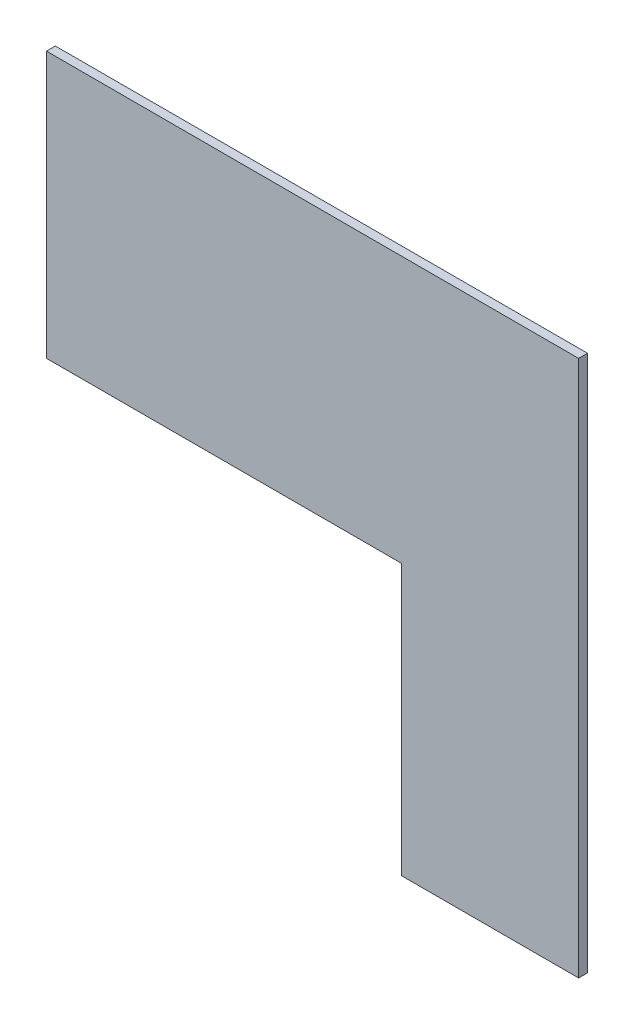
ISO-10303-21;
HEADER;
FILE_DESCRIPTION(('STEP AP214'),'2;1');
FILE_NAME('part.step','',(''),(''),'','','');
FILE_SCHEMA(('AUTOMOTIVE_DESIGN { 1 0 10303 214 1 1 1 1 }'));
ENDSEC;
DATA;
#1=APPLICATION_CONTEXT('core data for automotive mechanical design processes');
#2=APPLICATION_PROTOCOL_DEFINITION('international standard','automotive_design',2000,#1);
#3=PRODUCT_CONTEXT('',#1,'mechanical');
#4=PRODUCT('Part','Part','',(#3));
#5=PRODUCT_RELATED_PRODUCT_CATEGORY('part','',(#4));
#6=PRODUCT_DEFINITION_FORMATION('','',#4);
#7=PRODUCT_DEFINITION_CONTEXT('part definition',#1,'design');
#8=PRODUCT_DEFINITION('design','',#6,#7);
#9=PRODUCT_DEFINITION_SHAPE('','',#8);
#10=(LENGTH_UNIT() NAMED_UNIT(*) SI_UNIT(.MILLI.,.METRE.));
#11=(NAMED_UNIT(*) PLANE_ANGLE_UNIT() SI_UNIT($,.RADIAN.));
#12=(NAMED_UNIT(*) SI_UNIT($,.STERADIAN.) SOLID_ANGLE_UNIT());
#13=UNCERTAINTY_MEASURE_WITH_UNIT(LENGTH_MEASURE(1.E-05),#10,'distance_accuracy_value','');
#14=(GEOMETRIC_REPRESENTATION_CONTEXT(3) GLOBAL_UNCERTAINTY_ASSIGNED_CONTEXT((#13)) GLOBAL_UNIT_ASSIGNED_CONTEXT((#10,
#11,#12)) REPRESENTATION_CONTEXT('',''));
#15=CARTESIAN_POINT('',(0.,0.,0.));
#16=DIRECTION('',(0.,0.,1.));
#17=DIRECTION('',(1.,0.,0.));
#18=AXIS2_PLACEMENT_3D('',#15,#16,#17);
#19=CARTESIAN_POINT('',(800.,0.,20.));
#20=DIRECTION('',(0.,1.,0.));
#21=DIRECTION('',(0.,0.,1.));
#22=AXIS2_PLACEMENT_3D('',#19,#20,#21);
#23=PLANE('',#22);
#24=DIRECTION('',(1.,0.,0.));
#25=VECTOR('',#24,1.);
#26=CARTESIAN_POINT('',(800.,0.,0.));
#27=LINE('',#26,#25);
#28=CARTESIAN_POINT('',(0.,0.,0.));
#29=VERTEX_POINT('',#28);
#30=CARTESIAN_POINT('',(800.,0.,0.));
#31=VERTEX_POINT('',#30);
#32=EDGE_CURVE('E117',#29,#31,#27,.T.);
#33=ORIENTED_EDGE('',*,*,#32,.T.);
#34=DIRECTION('',(0.,0.,-1.));
#35=VECTOR('',#34,1.);
#36=CARTESIAN_POINT('',(800.,0.,20.));
#37=LINE('',#36,#35);
#38=CARTESIAN_POINT('',(800.,0.,20.));
#39=VERTEX_POINT('',#38);
#40=EDGE_CURVE('E11',#39,#31,#37,.T.);
#41=ORIENTED_EDGE('',*,*,#40,.F.);
#42=DIRECTION('',(1.,0.,0.));
#43=VECTOR('',#42,1.);
#44=CARTESIAN_POINT('',(800.,0.,20.));
#45=LINE('',#44,#43);
#46=CARTESIAN_POINT('',(0.,0.,20.));
#47=VERTEX_POINT('',#46);
#48=EDGE_CURVE('E127',#47,#39,#45,.T.);
#49=ORIENTED_EDGE('',*,*,#48,.F.);
#50=DIRECTION('',(0.,0.,-1.));
#51=VECTOR('',#50,1.);
#52=CARTESIAN_POINT('',(0.,0.,20.));
#53=LINE('',#52,#51);
#54=EDGE_CURVE('E113',#47,#29,#53,.T.);
#55=ORIENTED_EDGE('',*,*,#54,.T.);
#56=EDGE_LOOP('',(#33,#41,#49,#55));
#57=FACE_BOUND('',#56,.T.);
#58=ADVANCED_FACE('F33',(#57),#23,.F.);
#59=CARTESIAN_POINT('',(800.,-610.,20.));
#60=DIRECTION('',(1.,0.,0.));
#61=DIRECTION('',(0.,0.,-1.));
#62=AXIS2_PLACEMENT_3D('',#59,#60,#61);
#63=PLANE('',#62);
#64=DIRECTION('',(0.,-1.,0.));
#65=VECTOR('',#64,1.);
#66=CARTESIAN_POINT('',(800.,-610.,0.));
#67=LINE('',#66,#65);
#68=CARTESIAN_POINT('',(800.,-610.,0.));
#69=VERTEX_POINT('',#68);
#70=EDGE_CURVE('E120',#31,#69,#67,.T.);
#71=ORIENTED_EDGE('',*,*,#70,.T.);
#72=DIRECTION('',(0.,0.,-1.));
#73=VECTOR('',#72,1.);
#74=CARTESIAN_POINT('',(800.,-610.,20.));
#75=LINE('',#74,#73);
#76=CARTESIAN_POINT('',(800.,-610.,20.));
#77=VERTEX_POINT('',#76);
#78=EDGE_CURVE('E41',#77,#69,#75,.T.);
#79=ORIENTED_EDGE('',*,*,#78,.F.);
#80=DIRECTION('',(0.,-1.,0.));
#81=VECTOR('',#80,1.);
#82=CARTESIAN_POINT('',(800.,-610.,20.));
#83=LINE('',#82,#81);
#84=EDGE_CURVE('E86',#39,#77,#83,.T.);
#85=ORIENTED_EDGE('',*,*,#84,.F.);
#86=ORIENTED_EDGE('',*,*,#40,.T.);
#87=EDGE_LOOP('',(#71,#79,#85,#86));
#88=FACE_BOUND('',#87,.T.);
#89=ADVANCED_FACE('F151',(#88),#63,.F.);
#90=CARTESIAN_POINT('',(1200.,-610.,20.));
#91=DIRECTION('',(0.,1.,0.));
#92=DIRECTION('',(-1.,0.,0.));
#93=AXIS2_PLACEMENT_3D('',#90,#91,#92);
#94=PLANE('',#93);
#95=DIRECTION('',(1.,0.,0.));
#96=VECTOR('',#95,1.);
#97=CARTESIAN_POINT('',(1200.,-610.,0.));
#98=LINE('',#97,#96);
#99=CARTESIAN_POINT('',(1200.,-610.,0.));
#100=VERTEX_POINT('',#99);
#101=EDGE_CURVE('E122',#69,#100,#98,.T.);
#102=ORIENTED_EDGE('',*,*,#101,.T.);
#103=DIRECTION('',(0.,0.,-1.));
#104=VECTOR('',#103,1.);
#105=CARTESIAN_POINT('',(1200.,-610.,20.));
#106=LINE('',#105,#104);
#107=CARTESIAN_POINT('',(1200.,-610.,20.));
#108=VERTEX_POINT('',#107);
#109=EDGE_CURVE('E108',#108,#100,#106,.T.);
#110=ORIENTED_EDGE('',*,*,#109,.F.);
#111=DIRECTION('',(1.,0.,0.));
#112=VECTOR('',#111,1.);
#113=CARTESIAN_POINT('',(1200.,-610.,20.));
#114=LINE('',#113,#112);
#115=EDGE_CURVE('E99',#77,#108,#114,.T.);
#116=ORIENTED_EDGE('',*,*,#115,.F.);
#117=ORIENTED_EDGE('',*,*,#78,.T.);
#118=EDGE_LOOP('',(#102,#110,#116,#117));
#119=FACE_BOUND('',#118,.T.);
#120=ADVANCED_FACE('F133',(#119),#94,.F.);
#121=CARTESIAN_POINT('',(1200.,600.,20.));
#122=DIRECTION('',(-1.,0.,0.));
#123=DIRECTION('',(0.,-1.,0.));
#124=AXIS2_PLACEMENT_3D('',#121,#122,#123);
#125=PLANE('',#124);
#126=DIRECTION('',(0.,1.,0.));
#127=VECTOR('',#126,1.);
#128=CARTESIAN_POINT('',(1200.,600.,0.));
#129=LINE('',#128,#127);
#130=CARTESIAN_POINT('',(1200.,600.,0.));
#131=VERTEX_POINT('',#130);
#132=EDGE_CURVE('E107',#100,#131,#129,.T.);
#133=ORIENTED_EDGE('',*,*,#132,.T.);
#134=DIRECTION('',(0.,0.,-1.));
#135=VECTOR('',#134,1.);
#136=CARTESIAN_POINT('',(1200.,600.,20.));
#137=LINE('',#136,#135);
#138=CARTESIAN_POINT('',(1200.,600.,20.));
#139=VERTEX_POINT('',#138);
#140=EDGE_CURVE('E104',#139,#131,#137,.T.);
#141=ORIENTED_EDGE('',*,*,#140,.F.);
#142=DIRECTION('',(0.,1.,0.));
#143=VECTOR('',#142,1.);
#144=CARTESIAN_POINT('',(1200.,600.,20.));
#145=LINE('',#144,#143);
#146=EDGE_CURVE('E93',#108,#139,#145,.T.);
#147=ORIENTED_EDGE('',*,*,#146,.F.);
#148=ORIENTED_EDGE('',*,*,#109,.T.);
#149=EDGE_LOOP('',(#133,#141,#147,#148));
#150=FACE_BOUND('',#149,.T.);
#151=ADVANCED_FACE('F105',(#150),#125,.F.);
#152=CARTESIAN_POINT('',(0.,600.,20.));
#153=DIRECTION('',(0.,-1.,0.));
#154=DIRECTION('',(0.,0.,-1.));
#155=AXIS2_PLACEMENT_3D('',#152,#153,#154);
#156=PLANE('',#155);
#157=DIRECTION('',(-1.,0.,0.));
#158=VECTOR('',#157,1.);
#159=CARTESIAN_POINT('',(0.,600.,0.));
#160=LINE('',#159,#158);
#161=CARTESIAN_POINT('',(0.,600.,0.));
#162=VERTEX_POINT('',#161);
#163=EDGE_CURVE('E72',#131,#162,#160,.T.);
#164=ORIENTED_EDGE('',*,*,#163,.T.);
#165=DIRECTION('',(0.,0.,-1.));
#166=VECTOR('',#165,1.);
#167=CARTESIAN_POINT('',(0.,600.,20.));
#168=LINE('',#167,#166);
#169=CARTESIAN_POINT('',(0.,600.,20.));
#170=VERTEX_POINT('',#169);
#171=EDGE_CURVE('E109',#170,#162,#168,.T.);
#172=ORIENTED_EDGE('',*,*,#171,.F.);
#173=DIRECTION('',(-1.,0.,0.));
#174=VECTOR('',#173,1.);
#175=CARTESIAN_POINT('',(0.,600.,20.));
#176=LINE('',#175,#174);
#177=EDGE_CURVE('E97',#139,#170,#176,.T.);
#178=ORIENTED_EDGE('',*,*,#177,.F.);
#179=ORIENTED_EDGE('',*,*,#140,.T.);
#180=EDGE_LOOP('',(#164,#172,#178,#179));
#181=FACE_BOUND('',#180,.T.);
#182=ADVANCED_FACE('F111',(#181),#156,.F.);
#183=CARTESIAN_POINT('',(0.,0.,20.));
#184=DIRECTION('',(1.,0.,0.));
#185=DIRECTION('',(0.,0.,-1.));
#186=AXIS2_PLACEMENT_3D('',#183,#184,#185);
#187=PLANE('',#186);
#188=DIRECTION('',(0.,-1.,0.));
#189=VECTOR('',#188,1.);
#190=CARTESIAN_POINT('',(0.,0.,0.));
#191=LINE('',#190,#189);
#192=EDGE_CURVE('E78',#162,#29,#191,.T.);
#193=ORIENTED_EDGE('',*,*,#192,.T.);
#194=ORIENTED_EDGE('',*,*,#54,.F.);
#195=DIRECTION('',(0.,-1.,0.));
#196=VECTOR('',#195,1.);
#197=CARTESIAN_POINT('',(0.,0.,20.));
#198=LINE('',#197,#196);
#199=EDGE_CURVE('E49',#170,#47,#198,.T.);
#200=ORIENTED_EDGE('',*,*,#199,.F.);
#201=ORIENTED_EDGE('',*,*,#171,.T.);
#202=EDGE_LOOP('',(#193,#194,#200,#201));
#203=FACE_BOUND('',#202,.T.);
#204=ADVANCED_FACE('F140',(#203),#187,.F.);
#205=CARTESIAN_POINT('',(0.,0.,20.));
#206=DIRECTION('',(0.,0.,-1.));
#207=DIRECTION('',(-1.,0.,0.));
#208=AXIS2_PLACEMENT_3D('',#205,#206,#207);
#209=PLANE('',#208);
#210=ORIENTED_EDGE('',*,*,#48,.T.);
#211=ORIENTED_EDGE('',*,*,#84,.T.);
#212=ORIENTED_EDGE('',*,*,#115,.T.);
#213=ORIENTED_EDGE('',*,*,#146,.T.);
#214=ORIENTED_EDGE('',*,*,#177,.T.);
#215=ORIENTED_EDGE('',*,*,#199,.T.);
#216=EDGE_LOOP('',(#210,#211,#212,#213,#214,#215));
#217=FACE_BOUND('',#216,.T.);
#218=ADVANCED_FACE('F95',(#217),#209,.F.);
#219=CARTESIAN_POINT('',(0.,0.,0.));
#220=DIRECTION('',(0.,0.,-1.));
#221=DIRECTION('',(-1.,0.,0.));
#222=AXIS2_PLACEMENT_3D('',#219,#220,#221);
#223=PLANE('',#222);
#224=ORIENTED_EDGE('',*,*,#32,.F.);
#225=ORIENTED_EDGE('',*,*,#192,.F.);
#226=ORIENTED_EDGE('',*,*,#163,.F.);
#227=ORIENTED_EDGE('',*,*,#132,.F.);
#228=ORIENTED_EDGE('',*,*,#101,.F.);
#229=ORIENTED_EDGE('',*,*,#70,.F.);
#230=EDGE_LOOP('',(#224,#225,#226,#227,#228,#229));
#231=FACE_BOUND('',#230,.T.);
#232=ADVANCED_FACE('F136',(#231),#223,.T.);
#233=CLOSED_SHELL('',(#58,#89,#120,#151,#182,#204,#218,#232));
#234=MANIFOLD_SOLID_BREP('B2',#233);
#235=ADVANCED_BREP_SHAPE_REPRESENTATION('',(#18,#234),#14);
#236=SHAPE_DEFINITION_REPRESENTATION(#9,#235);
ENDSEC;
END-ISO-10303-21;
